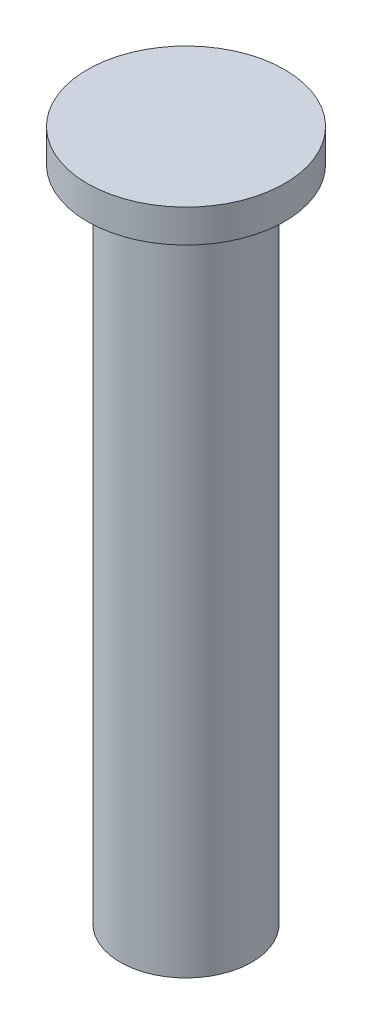
ISO-10303-21;
HEADER;
FILE_DESCRIPTION(('STEP AP214'),'2;1');
FILE_NAME('part.step','',(''),(''),'','','');
FILE_SCHEMA(('AUTOMOTIVE_DESIGN { 1 0 10303 214 1 1 1 1 }'));
ENDSEC;
DATA;
#1=APPLICATION_CONTEXT('core data for automotive mechanical design processes');
#2=APPLICATION_PROTOCOL_DEFINITION('international standard','automotive_design',2000,#1);
#3=PRODUCT_CONTEXT('',#1,'mechanical');
#4=PRODUCT('Part','Part','',(#3));
#5=PRODUCT_RELATED_PRODUCT_CATEGORY('part','',(#4));
#6=PRODUCT_DEFINITION_FORMATION('','',#4);
#7=PRODUCT_DEFINITION_CONTEXT('part definition',#1,'design');
#8=PRODUCT_DEFINITION('design','',#6,#7);
#9=PRODUCT_DEFINITION_SHAPE('','',#8);
#10=(LENGTH_UNIT() NAMED_UNIT(*) SI_UNIT(.MILLI.,.METRE.));
#11=(NAMED_UNIT(*) PLANE_ANGLE_UNIT() SI_UNIT($,.RADIAN.));
#12=(NAMED_UNIT(*) SI_UNIT($,.STERADIAN.) SOLID_ANGLE_UNIT());
#13=UNCERTAINTY_MEASURE_WITH_UNIT(LENGTH_MEASURE(1.E-05),#10,'distance_accuracy_value','');
#14=(GEOMETRIC_REPRESENTATION_CONTEXT(3) GLOBAL_UNCERTAINTY_ASSIGNED_CONTEXT((#13)) GLOBAL_UNIT_ASSIGNED_CONTEXT((#10,
#11,#12)) REPRESENTATION_CONTEXT('',''));
#15=CARTESIAN_POINT('',(0.,0.,0.));
#16=DIRECTION('',(0.,0.,1.));
#17=DIRECTION('',(1.,0.,0.));
#18=AXIS2_PLACEMENT_3D('',#15,#16,#17);
#19=CARTESIAN_POINT('',(100.,0.,0.));
#20=DIRECTION('',(0.,-1.,0.));
#21=DIRECTION('',(0.,0.,-1.));
#22=AXIS2_PLACEMENT_3D('',#19,#20,#21);
#23=PLANE('',#22);
#24=CARTESIAN_POINT('',(0.,0.,0.));
#25=DIRECTION('',(0.,-1.,0.));
#26=DIRECTION('',(0.,0.,-1.));
#27=AXIS2_PLACEMENT_3D('',#24,#25,#26);
#28=CIRCLE('',#27,100.);
#29=CARTESIAN_POINT('',(0.,0.,-100.));
#30=VERTEX_POINT('',#29);
#31=EDGE_CURVE('E51',#30,#30,#28,.T.);
#32=ORIENTED_EDGE('',*,*,#31,.T.);
#33=EDGE_LOOP('',(#32));
#34=FACE_BOUND('',#33,.T.);
#35=ADVANCED_FACE('F37',(#34),#23,.T.);
#36=CARTESIAN_POINT('',(0.,1050.,0.));
#37=DIRECTION('',(0.,1.,0.));
#38=DIRECTION('',(0.,0.,1.));
#39=AXIS2_PLACEMENT_3D('',#36,#37,#38);
#40=PLANE('',#39);
#41=CARTESIAN_POINT('',(0.,1050.,0.));
#42=DIRECTION('',(0.,-1.,0.));
#43=DIRECTION('',(0.,0.,-1.));
#44=AXIS2_PLACEMENT_3D('',#41,#42,#43);
#45=CIRCLE('',#44,150.);
#46=CARTESIAN_POINT('',(0.,1050.,-150.));
#47=VERTEX_POINT('',#46);
#48=EDGE_CURVE('E10',#47,#47,#45,.T.);
#49=ORIENTED_EDGE('',*,*,#48,.F.);
#50=EDGE_LOOP('',(#49));
#51=FACE_BOUND('',#50,.T.);
#52=ADVANCED_FACE('F69',(#51),#40,.T.);
#53=CARTESIAN_POINT('',(0.,0.,0.));
#54=DIRECTION('',(0.,-1.,0.));
#55=DIRECTION('',(0.,0.,-1.));
#56=AXIS2_PLACEMENT_3D('',#53,#54,#55);
#57=CYLINDRICAL_SURFACE('',#56,150.);
#58=ORIENTED_EDGE('',*,*,#48,.T.);
#59=EDGE_LOOP('',(#58));
#60=FACE_BOUND('',#59,.T.);
#61=CARTESIAN_POINT('',(0.,1000.,0.));
#62=DIRECTION('',(0.,-1.,0.));
#63=DIRECTION('',(0.,0.,-1.));
#64=AXIS2_PLACEMENT_3D('',#61,#62,#63);
#65=CIRCLE('',#64,150.);
#66=CARTESIAN_POINT('',(0.,1000.,-150.));
#67=VERTEX_POINT('',#66);
#68=EDGE_CURVE('E43',#67,#67,#65,.T.);
#69=ORIENTED_EDGE('',*,*,#68,.F.);
#70=EDGE_LOOP('',(#69));
#71=FACE_BOUND('',#70,.T.);
#72=ADVANCED_FACE('F66',(#60,#71),#57,.T.);
#73=CARTESIAN_POINT('',(150.,1000.,0.));
#74=DIRECTION('',(0.,-1.,0.));
#75=DIRECTION('',(0.,0.,-1.));
#76=AXIS2_PLACEMENT_3D('',#73,#74,#75);
#77=PLANE('',#76);
#78=ORIENTED_EDGE('',*,*,#68,.T.);
#79=EDGE_LOOP('',(#78));
#80=FACE_BOUND('',#79,.T.);
#81=CARTESIAN_POINT('',(0.,1000.,0.));
#82=DIRECTION('',(0.,-1.,0.));
#83=DIRECTION('',(0.,0.,-1.));
#84=AXIS2_PLACEMENT_3D('',#81,#82,#83);
#85=CIRCLE('',#84,100.);
#86=CARTESIAN_POINT('',(0.,1000.,-100.));
#87=VERTEX_POINT('',#86);
#88=EDGE_CURVE('E47',#87,#87,#85,.T.);
#89=ORIENTED_EDGE('',*,*,#88,.F.);
#90=EDGE_LOOP('',(#89));
#91=FACE_BOUND('',#90,.T.);
#92=ADVANCED_FACE('F60',(#80,#91),#77,.T.);
#93=CARTESIAN_POINT('',(0.,0.,0.));
#94=DIRECTION('',(0.,-1.,0.));
#95=DIRECTION('',(0.,0.,-1.));
#96=AXIS2_PLACEMENT_3D('',#93,#94,#95);
#97=CYLINDRICAL_SURFACE('',#96,100.);
#98=ORIENTED_EDGE('',*,*,#88,.T.);
#99=EDGE_LOOP('',(#98));
#100=FACE_BOUND('',#99,.T.);
#101=ORIENTED_EDGE('',*,*,#31,.F.);
#102=EDGE_LOOP('',(#101));
#103=FACE_BOUND('',#102,.T.);
#104=ADVANCED_FACE('F58',(#100,#103),#97,.T.);
#105=CLOSED_SHELL('',(#35,#52,#72,#92,#104));
#106=MANIFOLD_SOLID_BREP('B2',#105);
#107=ADVANCED_BREP_SHAPE_REPRESENTATION('',(#18,#106),#14);
#108=SHAPE_DEFINITION_REPRESENTATION(#9,#107);
ENDSEC;
END-ISO-10303-21;
